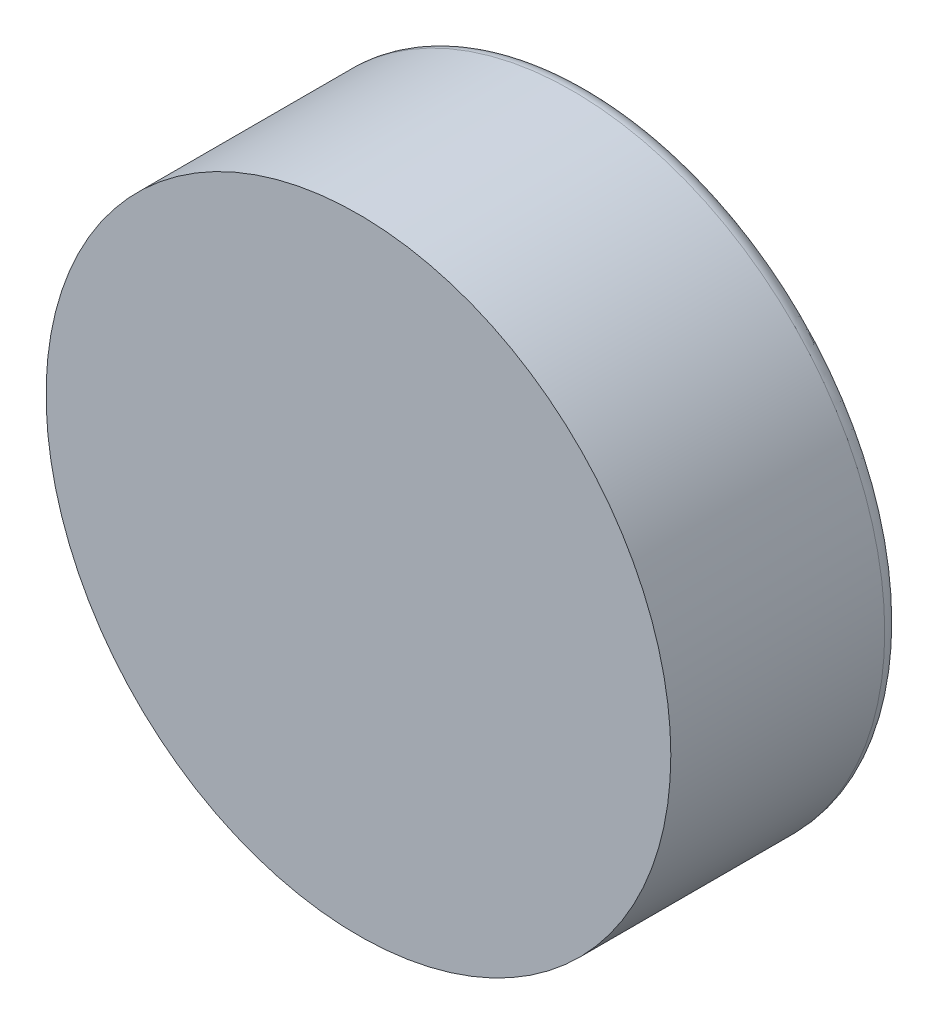
ISO-10303-21;
HEADER;
FILE_DESCRIPTION(('STEP AP214'),'2;1');
FILE_NAME('part.step','',(''),(''),'','','');
FILE_SCHEMA(('AUTOMOTIVE_DESIGN { 1 0 10303 214 1 1 1 1 }'));
ENDSEC;
DATA;
#1=APPLICATION_CONTEXT('core data for automotive mechanical design processes');
#2=APPLICATION_PROTOCOL_DEFINITION('international standard','automotive_design',2000,#1);
#3=PRODUCT_CONTEXT('',#1,'mechanical');
#4=PRODUCT('Part','Part','',(#3));
#5=PRODUCT_RELATED_PRODUCT_CATEGORY('part','',(#4));
#6=PRODUCT_DEFINITION_FORMATION('','',#4);
#7=PRODUCT_DEFINITION_CONTEXT('part definition',#1,'design');
#8=PRODUCT_DEFINITION('design','',#6,#7);
#9=PRODUCT_DEFINITION_SHAPE('','',#8);
#10=(LENGTH_UNIT() NAMED_UNIT(*) SI_UNIT(.MILLI.,.METRE.));
#11=(NAMED_UNIT(*) PLANE_ANGLE_UNIT() SI_UNIT($,.RADIAN.));
#12=(NAMED_UNIT(*) SI_UNIT($,.STERADIAN.) SOLID_ANGLE_UNIT());
#13=UNCERTAINTY_MEASURE_WITH_UNIT(LENGTH_MEASURE(1.E-05),#10,'distance_accuracy_value','');
#14=(GEOMETRIC_REPRESENTATION_CONTEXT(3) GLOBAL_UNCERTAINTY_ASSIGNED_CONTEXT((#13)) GLOBAL_UNIT_ASSIGNED_CONTEXT((#10,
#11,#12)) REPRESENTATION_CONTEXT('',''));
#15=CARTESIAN_POINT('',(0.,0.,0.));
#16=DIRECTION('',(0.,0.,1.));
#17=DIRECTION('',(1.,0.,0.));
#18=AXIS2_PLACEMENT_3D('',#15,#16,#17);
#19=CARTESIAN_POINT('',(0.,0.,3.));
#20=DIRECTION('',(0.,0.,-1.));
#21=DIRECTION('',(-1.,0.,0.));
#22=AXIS2_PLACEMENT_3D('',#19,#20,#21);
#23=PLANE('',#22);
#24=CARTESIAN_POINT('',(0.,0.,3.));
#25=DIRECTION('',(0.,0.,1.));
#26=DIRECTION('',(1.,0.,0.));
#27=AXIS2_PLACEMENT_3D('',#24,#25,#26);
#28=CIRCLE('',#27,4.2);
#29=CARTESIAN_POINT('',(4.2,0.,3.));
#30=VERTEX_POINT('',#29);
#31=EDGE_CURVE('E17',#30,#30,#28,.F.);
#32=ORIENTED_EDGE('',*,*,#31,.T.);
#33=EDGE_LOOP('',(#32));
#34=FACE_BOUND('',#33,.T.);
#35=ADVANCED_FACE('F14',(#34),#23,.T.);
#36=CARTESIAN_POINT('',(0.,0.,0.));
#37=DIRECTION('',(0.,0.,1.));
#38=DIRECTION('',(1.,0.,0.));
#39=AXIS2_PLACEMENT_3D('',#36,#37,#38);
#40=CYLINDRICAL_SURFACE('',#39,4.2);
#41=CARTESIAN_POINT('',(0.,0.,0.));
#42=DIRECTION('',(0.,0.,1.));
#43=DIRECTION('',(1.,0.,0.));
#44=AXIS2_PLACEMENT_3D('',#41,#42,#43);
#45=CIRCLE('',#44,4.2);
#46=CARTESIAN_POINT('',(4.2,0.,0.));
#47=VERTEX_POINT('',#46);
#48=EDGE_CURVE('E55',#47,#47,#45,.T.);
#49=ORIENTED_EDGE('',*,*,#48,.F.);
#50=EDGE_LOOP('',(#49));
#51=FACE_BOUND('',#50,.T.);
#52=ORIENTED_EDGE('',*,*,#31,.F.);
#53=EDGE_LOOP('',(#52));
#54=FACE_BOUND('',#53,.T.);
#55=ADVANCED_FACE('F63',(#51,#54),#40,.F.);
#56=CARTESIAN_POINT('',(0.,0.,0.));
#57=DIRECTION('',(0.,0.,-1.));
#58=DIRECTION('',(-1.,0.,0.));
#59=AXIS2_PLACEMENT_3D('',#56,#57,#58);
#60=PLANE('',#59);
#61=ORIENTED_EDGE('',*,*,#48,.T.);
#62=EDGE_LOOP('',(#61));
#63=FACE_BOUND('',#62,.T.);
#64=CARTESIAN_POINT('',(0.,0.,0.));
#65=DIRECTION('',(0.,0.,1.));
#66=DIRECTION('',(1.,0.,0.));
#67=AXIS2_PLACEMENT_3D('',#64,#65,#66);
#68=CIRCLE('',#67,4.35);
#69=CARTESIAN_POINT('',(4.35,0.,0.));
#70=VERTEX_POINT('',#69);
#71=EDGE_CURVE('E26',#70,#70,#68,.T.);
#72=ORIENTED_EDGE('',*,*,#71,.F.);
#73=EDGE_LOOP('',(#72));
#74=FACE_BOUND('',#73,.T.);
#75=ADVANCED_FACE('F65',(#63,#74),#60,.T.);
#76=CARTESIAN_POINT('',(0.,0.,3.4));
#77=DIRECTION('',(0.,0.,-1.));
#78=DIRECTION('',(-1.,0.,0.));
#79=AXIS2_PLACEMENT_3D('',#76,#77,#78);
#80=PLANE('',#79);
#81=CARTESIAN_POINT('',(0.,0.,3.4));
#82=DIRECTION('',(0.,0.,1.));
#83=DIRECTION('',(1.,0.,0.));
#84=AXIS2_PLACEMENT_3D('',#81,#82,#83);
#85=CIRCLE('',#84,4.6);
#86=CARTESIAN_POINT('',(4.6,0.,3.4));
#87=VERTEX_POINT('',#86);
#88=EDGE_CURVE('E21',#87,#87,#85,.F.);
#89=ORIENTED_EDGE('',*,*,#88,.F.);
#90=EDGE_LOOP('',(#89));
#91=FACE_BOUND('',#90,.T.);
#92=ADVANCED_FACE('F42',(#91),#80,.F.);
#93=CARTESIAN_POINT('',(0.,0.,0.25));
#94=DIRECTION('',(0.,0.,-1.));
#95=DIRECTION('',(-1.,0.,0.));
#96=AXIS2_PLACEMENT_3D('',#93,#94,#95);
#97=TOROIDAL_SURFACE('',#96,4.35,0.25);
#98=ORIENTED_EDGE('',*,*,#71,.T.);
#99=EDGE_LOOP('',(#98));
#100=FACE_BOUND('',#99,.T.);
#101=CARTESIAN_POINT('',(0.,0.,0.25));
#102=DIRECTION('',(0.,0.,1.));
#103=DIRECTION('',(1.,0.,0.));
#104=AXIS2_PLACEMENT_3D('',#101,#102,#103);
#105=CIRCLE('',#104,4.6);
#106=CARTESIAN_POINT('',(4.6,0.,0.25));
#107=VERTEX_POINT('',#106);
#108=EDGE_CURVE('E10',#107,#107,#105,.T.);
#109=ORIENTED_EDGE('',*,*,#108,.F.);
#110=EDGE_LOOP('',(#109));
#111=FACE_BOUND('',#110,.T.);
#112=ADVANCED_FACE('F36',(#100,#111),#97,.T.);
#113=CARTESIAN_POINT('',(0.,0.,0.));
#114=DIRECTION('',(0.,0.,1.));
#115=DIRECTION('',(1.,0.,0.));
#116=AXIS2_PLACEMENT_3D('',#113,#114,#115);
#117=CYLINDRICAL_SURFACE('',#116,4.6);
#118=ORIENTED_EDGE('',*,*,#108,.T.);
#119=EDGE_LOOP('',(#118));
#120=FACE_BOUND('',#119,.T.);
#121=ORIENTED_EDGE('',*,*,#88,.T.);
#122=EDGE_LOOP('',(#121));
#123=FACE_BOUND('',#122,.T.);
#124=ADVANCED_FACE('F41',(#120,#123),#117,.T.);
#125=CLOSED_SHELL('',(#35,#55,#75,#92,#112,#124));
#126=MANIFOLD_SOLID_BREP('B1',#125);
#127=ADVANCED_BREP_SHAPE_REPRESENTATION('',(#18,#126),#14);
#128=SHAPE_DEFINITION_REPRESENTATION(#9,#127);
ENDSEC;
END-ISO-10303-21;
